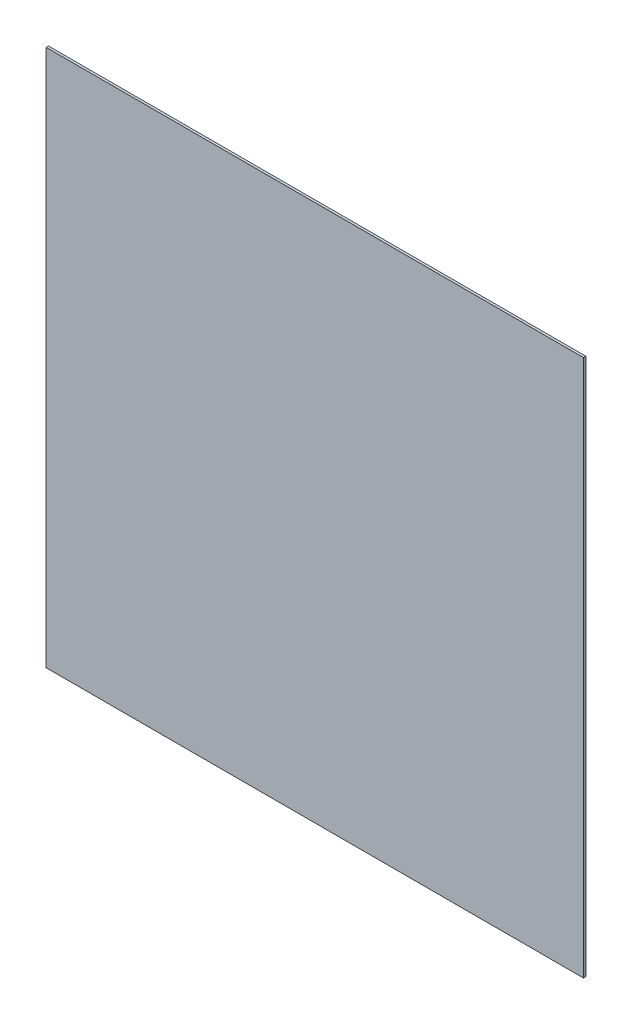
ISO-10303-21;
HEADER;
FILE_DESCRIPTION(('STEP AP214'),'2;1');
FILE_NAME('part.step','',(''),(''),'','','');
FILE_SCHEMA(('AUTOMOTIVE_DESIGN { 1 0 10303 214 1 1 1 1 }'));
ENDSEC;
DATA;
#1=APPLICATION_CONTEXT('core data for automotive mechanical design processes');
#2=APPLICATION_PROTOCOL_DEFINITION('international standard','automotive_design',2000,#1);
#3=PRODUCT_CONTEXT('',#1,'mechanical');
#4=PRODUCT('Part','Part','',(#3));
#5=PRODUCT_RELATED_PRODUCT_CATEGORY('part','',(#4));
#6=PRODUCT_DEFINITION_FORMATION('','',#4);
#7=PRODUCT_DEFINITION_CONTEXT('part definition',#1,'design');
#8=PRODUCT_DEFINITION('design','',#6,#7);
#9=PRODUCT_DEFINITION_SHAPE('','',#8);
#10=(LENGTH_UNIT() NAMED_UNIT(*) SI_UNIT(.MILLI.,.METRE.));
#11=(NAMED_UNIT(*) PLANE_ANGLE_UNIT() SI_UNIT($,.RADIAN.));
#12=(NAMED_UNIT(*) SI_UNIT($,.STERADIAN.) SOLID_ANGLE_UNIT());
#13=UNCERTAINTY_MEASURE_WITH_UNIT(LENGTH_MEASURE(1.E-05),#10,'distance_accuracy_value','');
#14=(GEOMETRIC_REPRESENTATION_CONTEXT(3) GLOBAL_UNCERTAINTY_ASSIGNED_CONTEXT((#13)) GLOBAL_UNIT_ASSIGNED_CONTEXT((#10,
#11,#12)) REPRESENTATION_CONTEXT('',''));
#15=CARTESIAN_POINT('',(0.,0.,0.));
#16=DIRECTION('',(0.,0.,1.));
#17=DIRECTION('',(1.,0.,0.));
#18=AXIS2_PLACEMENT_3D('',#15,#16,#17);
#19=CARTESIAN_POINT('',(-57.4701247114355,-57.4701247114356,0.508));
#20=DIRECTION('',(1.,0.,0.));
#21=DIRECTION('',(0.,0.,-1.));
#22=AXIS2_PLACEMENT_3D('',#19,#20,#21);
#23=PLANE('',#22);
#24=DIRECTION('',(0.,-1.,0.));
#25=VECTOR('',#24,1.);
#26=CARTESIAN_POINT('',(-57.4701247114355,-57.4701247114356,0.));
#27=LINE('',#26,#25);
#28=CARTESIAN_POINT('',(-57.4701247114355,57.4701247114355,0.));
#29=VERTEX_POINT('',#28);
#30=CARTESIAN_POINT('',(-57.4701247114355,-57.4701247114356,0.));
#31=VERTEX_POINT('',#30);
#32=EDGE_CURVE('E102',#29,#31,#27,.T.);
#33=ORIENTED_EDGE('',*,*,#32,.T.);
#34=DIRECTION('',(0.,0.,-1.));
#35=VECTOR('',#34,1.);
#36=CARTESIAN_POINT('',(-57.4701247114355,-57.4701247114356,0.508));
#37=LINE('',#36,#35);
#38=CARTESIAN_POINT('',(-57.4701247114355,-57.4701247114356,0.508));
#39=VERTEX_POINT('',#38);
#40=EDGE_CURVE('E11',#39,#31,#37,.T.);
#41=ORIENTED_EDGE('',*,*,#40,.F.);
#42=DIRECTION('',(0.,-1.,0.));
#43=VECTOR('',#42,1.);
#44=CARTESIAN_POINT('',(-57.4701247114355,-57.4701247114356,0.508));
#45=LINE('',#44,#43);
#46=CARTESIAN_POINT('',(-57.4701247114355,57.4701247114355,0.508));
#47=VERTEX_POINT('',#46);
#48=EDGE_CURVE('E90',#47,#39,#45,.T.);
#49=ORIENTED_EDGE('',*,*,#48,.F.);
#50=DIRECTION('',(0.,0.,-1.));
#51=VECTOR('',#50,1.);
#52=CARTESIAN_POINT('',(-57.4701247114355,57.4701247114355,0.508));
#53=LINE('',#52,#51);
#54=EDGE_CURVE('E98',#47,#29,#53,.T.);
#55=ORIENTED_EDGE('',*,*,#54,.T.);
#56=EDGE_LOOP('',(#33,#41,#49,#55));
#57=FACE_BOUND('',#56,.T.);
#58=ADVANCED_FACE('F39',(#57),#23,.F.);
#59=CARTESIAN_POINT('',(57.4701247114356,-57.4701247114355,0.508));
#60=DIRECTION('',(0.,1.,0.));
#61=DIRECTION('',(-1.,0.,0.));
#62=AXIS2_PLACEMENT_3D('',#59,#60,#61);
#63=PLANE('',#62);
#64=DIRECTION('',(1.,0.,0.));
#65=VECTOR('',#64,1.);
#66=CARTESIAN_POINT('',(57.4701247114356,-57.4701247114355,0.));
#67=LINE('',#66,#65);
#68=CARTESIAN_POINT('',(57.4701247114356,-57.4701247114355,0.));
#69=VERTEX_POINT('',#68);
#70=EDGE_CURVE('E94',#31,#69,#67,.T.);
#71=ORIENTED_EDGE('',*,*,#70,.T.);
#72=DIRECTION('',(0.,0.,-1.));
#73=VECTOR('',#72,1.);
#74=CARTESIAN_POINT('',(57.4701247114356,-57.4701247114355,0.508));
#75=LINE('',#74,#73);
#76=CARTESIAN_POINT('',(57.4701247114356,-57.4701247114355,0.508));
#77=VERTEX_POINT('',#76);
#78=EDGE_CURVE('E47',#77,#69,#75,.T.);
#79=ORIENTED_EDGE('',*,*,#78,.F.);
#80=DIRECTION('',(1.,0.,0.));
#81=VECTOR('',#80,1.);
#82=CARTESIAN_POINT('',(57.4701247114356,-57.4701247114355,0.508));
#83=LINE('',#82,#81);
#84=EDGE_CURVE('E85',#39,#77,#83,.T.);
#85=ORIENTED_EDGE('',*,*,#84,.F.);
#86=ORIENTED_EDGE('',*,*,#40,.T.);
#87=EDGE_LOOP('',(#71,#79,#85,#86));
#88=FACE_BOUND('',#87,.T.);
#89=ADVANCED_FACE('F93',(#88),#63,.F.);
#90=CARTESIAN_POINT('',(57.4701247114356,-57.4701247114355,0.508));
#91=DIRECTION('',(-1.,0.,0.));
#92=DIRECTION('',(0.,0.,1.));
#93=AXIS2_PLACEMENT_3D('',#90,#91,#92);
#94=PLANE('',#93);
#95=DIRECTION('',(0.,1.,0.));
#96=VECTOR('',#95,1.);
#97=CARTESIAN_POINT('',(57.4701247114356,-57.4701247114355,0.));
#98=LINE('',#97,#96);
#99=CARTESIAN_POINT('',(57.4701247114356,57.4701247114355,0.));
#100=VERTEX_POINT('',#99);
#101=EDGE_CURVE('E72',#69,#100,#98,.T.);
#102=ORIENTED_EDGE('',*,*,#101,.T.);
#103=DIRECTION('',(0.,0.,-1.));
#104=VECTOR('',#103,1.);
#105=CARTESIAN_POINT('',(57.4701247114356,57.4701247114355,0.508));
#106=LINE('',#105,#104);
#107=CARTESIAN_POINT('',(57.4701247114356,57.4701247114355,0.508));
#108=VERTEX_POINT('',#107);
#109=EDGE_CURVE('E95',#108,#100,#106,.T.);
#110=ORIENTED_EDGE('',*,*,#109,.F.);
#111=DIRECTION('',(0.,1.,0.));
#112=VECTOR('',#111,1.);
#113=CARTESIAN_POINT('',(57.4701247114356,-57.4701247114355,0.508));
#114=LINE('',#113,#112);
#115=EDGE_CURVE('E88',#77,#108,#114,.T.);
#116=ORIENTED_EDGE('',*,*,#115,.F.);
#117=ORIENTED_EDGE('',*,*,#78,.T.);
#118=EDGE_LOOP('',(#102,#110,#116,#117));
#119=FACE_BOUND('',#118,.T.);
#120=ADVANCED_FACE('F96',(#119),#94,.F.);
#121=CARTESIAN_POINT('',(57.4701247114356,57.4701247114355,0.508));
#122=DIRECTION('',(0.,-1.,0.));
#123=DIRECTION('',(1.,0.,0.));
#124=AXIS2_PLACEMENT_3D('',#121,#122,#123);
#125=PLANE('',#124);
#126=DIRECTION('',(-1.,0.,0.));
#127=VECTOR('',#126,1.);
#128=CARTESIAN_POINT('',(57.4701247114356,57.4701247114355,0.));
#129=LINE('',#128,#127);
#130=EDGE_CURVE('E78',#100,#29,#129,.T.);
#131=ORIENTED_EDGE('',*,*,#130,.T.);
#132=ORIENTED_EDGE('',*,*,#54,.F.);
#133=DIRECTION('',(-1.,0.,0.));
#134=VECTOR('',#133,1.);
#135=CARTESIAN_POINT('',(57.4701247114356,57.4701247114355,0.508));
#136=LINE('',#135,#134);
#137=EDGE_CURVE('E55',#108,#47,#136,.T.);
#138=ORIENTED_EDGE('',*,*,#137,.F.);
#139=ORIENTED_EDGE('',*,*,#109,.T.);
#140=EDGE_LOOP('',(#131,#132,#138,#139));
#141=FACE_BOUND('',#140,.T.);
#142=ADVANCED_FACE('F109',(#141),#125,.F.);
#143=CARTESIAN_POINT('',(0.,0.,0.508));
#144=DIRECTION('',(0.,0.,1.));
#145=DIRECTION('',(1.,0.,0.));
#146=AXIS2_PLACEMENT_3D('',#143,#144,#145);
#147=PLANE('',#146);
#148=ORIENTED_EDGE('',*,*,#48,.T.);
#149=ORIENTED_EDGE('',*,*,#84,.T.);
#150=ORIENTED_EDGE('',*,*,#115,.T.);
#151=ORIENTED_EDGE('',*,*,#137,.T.);
#152=EDGE_LOOP('',(#148,#149,#150,#151));
#153=FACE_BOUND('',#152,.T.);
#154=ADVANCED_FACE('F86',(#153),#147,.T.);
#155=CARTESIAN_POINT('',(0.,0.,0.));
#156=DIRECTION('',(0.,0.,1.));
#157=DIRECTION('',(1.,0.,0.));
#158=AXIS2_PLACEMENT_3D('',#155,#156,#157);
#159=PLANE('',#158);
#160=ORIENTED_EDGE('',*,*,#32,.F.);
#161=ORIENTED_EDGE('',*,*,#130,.F.);
#162=ORIENTED_EDGE('',*,*,#101,.F.);
#163=ORIENTED_EDGE('',*,*,#70,.F.);
#164=EDGE_LOOP('',(#160,#161,#162,#163));
#165=FACE_BOUND('',#164,.T.);
#166=ADVANCED_FACE('F112',(#165),#159,.F.);
#167=CLOSED_SHELL('',(#58,#89,#120,#142,#154,#166));
#168=MANIFOLD_SOLID_BREP('B2',#167);
#169=ADVANCED_BREP_SHAPE_REPRESENTATION('',(#18,#168),#14);
#170=SHAPE_DEFINITION_REPRESENTATION(#9,#169);
ENDSEC;
END-ISO-10303-21;
